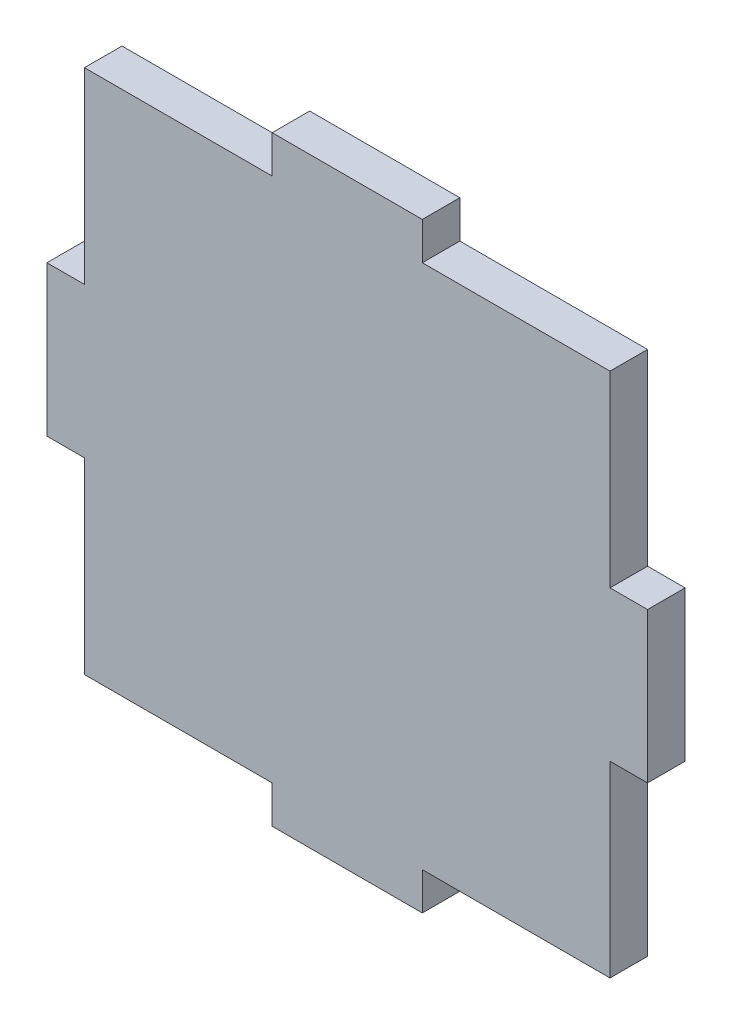
ISO-10303-21;
HEADER;
FILE_DESCRIPTION(('STEP AP214'),'2;1');
FILE_NAME('part.step','',(''),(''),'','','');
FILE_SCHEMA(('AUTOMOTIVE_DESIGN { 1 0 10303 214 1 1 1 1 }'));
ENDSEC;
DATA;
#1=APPLICATION_CONTEXT('core data for automotive mechanical design processes');
#2=APPLICATION_PROTOCOL_DEFINITION('international standard','automotive_design',2000,#1);
#3=PRODUCT_CONTEXT('',#1,'mechanical');
#4=PRODUCT('Part','Part','',(#3));
#5=PRODUCT_RELATED_PRODUCT_CATEGORY('part','',(#4));
#6=PRODUCT_DEFINITION_FORMATION('','',#4);
#7=PRODUCT_DEFINITION_CONTEXT('part definition',#1,'design');
#8=PRODUCT_DEFINITION('design','',#6,#7);
#9=PRODUCT_DEFINITION_SHAPE('','',#8);
#10=(LENGTH_UNIT() NAMED_UNIT(*) SI_UNIT(.MILLI.,.METRE.));
#11=(NAMED_UNIT(*) PLANE_ANGLE_UNIT() SI_UNIT($,.RADIAN.));
#12=(NAMED_UNIT(*) SI_UNIT($,.STERADIAN.) SOLID_ANGLE_UNIT());
#13=UNCERTAINTY_MEASURE_WITH_UNIT(LENGTH_MEASURE(1.E-05),#10,'distance_accuracy_value','');
#14=(GEOMETRIC_REPRESENTATION_CONTEXT(3) GLOBAL_UNCERTAINTY_ASSIGNED_CONTEXT((#13)) GLOBAL_UNIT_ASSIGNED_CONTEXT((#10,
#11,#12)) REPRESENTATION_CONTEXT('',''));
#15=CARTESIAN_POINT('',(0.,0.,0.));
#16=DIRECTION('',(0.,0.,1.));
#17=DIRECTION('',(1.,0.,0.));
#18=AXIS2_PLACEMENT_3D('',#15,#16,#17);
#19=CARTESIAN_POINT('',(138.962770275042,-1.5185006606796E-13,6.35));
#20=DIRECTION('',(1.,0.,0.));
#21=DIRECTION('',(0.,1.,0.));
#22=AXIS2_PLACEMENT_3D('',#19,#20,#21);
#23=PLANE('',#22);
#24=DIRECTION('',(0.,-1.,0.));
#25=VECTOR('',#24,1.);
#26=CARTESIAN_POINT('',(138.962770275042,-1.5185006606796E-13,0.));
#27=LINE('',#26,#25);
#28=CARTESIAN_POINT('',(138.962770275041,-334.378401611212,0.));
#29=VERTEX_POINT('',#28);
#30=CARTESIAN_POINT('',(138.962770275041,-359.778401611212,0.));
#31=VERTEX_POINT('',#30);
#32=EDGE_CURVE('E342',#29,#31,#27,.T.);
#33=ORIENTED_EDGE('',*,*,#32,.T.);
#34=DIRECTION('',(0.,0.,-1.));
#35=VECTOR('',#34,1.);
#36=CARTESIAN_POINT('',(138.962770275041,-359.778401611212,6.35));
#37=LINE('',#36,#35);
#38=CARTESIAN_POINT('',(138.962770275041,-359.778401611212,6.35));
#39=VERTEX_POINT('',#38);
#40=EDGE_CURVE('E12',#39,#31,#37,.T.);
#41=ORIENTED_EDGE('',*,*,#40,.F.);
#42=DIRECTION('',(0.,-1.,0.));
#43=VECTOR('',#42,1.);
#44=CARTESIAN_POINT('',(138.962770275042,-1.5185006606796E-13,6.35));
#45=LINE('',#44,#43);
#46=CARTESIAN_POINT('',(138.962770275041,-334.378401611212,6.35));
#47=VERTEX_POINT('',#46);
#48=EDGE_CURVE('E371',#47,#39,#45,.T.);
#49=ORIENTED_EDGE('',*,*,#48,.F.);
#50=DIRECTION('',(0.,0.,-1.));
#51=VECTOR('',#50,1.);
#52=CARTESIAN_POINT('',(138.962770275041,-334.378401611212,6.35));
#53=LINE('',#52,#51);
#54=EDGE_CURVE('E104',#47,#29,#53,.T.);
#55=ORIENTED_EDGE('',*,*,#54,.T.);
#56=EDGE_LOOP('',(#33,#41,#49,#55));
#57=FACE_BOUND('',#56,.T.);
#58=ADVANCED_FACE('F85',(#57),#23,.F.);
#59=CARTESIAN_POINT('',(0.,-359.778401611212,6.35));
#60=DIRECTION('',(0.,1.,0.));
#61=DIRECTION('',(0.,0.,1.));
#62=AXIS2_PLACEMENT_3D('',#59,#60,#61);
#63=PLANE('',#62);
#64=DIRECTION('',(1.,0.,0.));
#65=VECTOR('',#64,1.);
#66=CARTESIAN_POINT('',(0.,-359.778401611212,0.));
#67=LINE('',#66,#65);
#68=CARTESIAN_POINT('',(145.312770275041,-359.778401611212,0.));
#69=VERTEX_POINT('',#68);
#70=EDGE_CURVE('E372',#31,#69,#67,.T.);
#71=ORIENTED_EDGE('',*,*,#70,.T.);
#72=DIRECTION('',(0.,0.,-1.));
#73=VECTOR('',#72,1.);
#74=CARTESIAN_POINT('',(145.312770275041,-359.778401611212,6.35));
#75=LINE('',#74,#73);
#76=CARTESIAN_POINT('',(145.312770275041,-359.778401611212,6.35));
#77=VERTEX_POINT('',#76);
#78=EDGE_CURVE('E95',#77,#69,#75,.T.);
#79=ORIENTED_EDGE('',*,*,#78,.F.);
#80=DIRECTION('',(1.,0.,0.));
#81=VECTOR('',#80,1.);
#82=CARTESIAN_POINT('',(0.,-359.778401611212,6.35));
#83=LINE('',#82,#81);
#84=EDGE_CURVE('E378',#39,#77,#83,.T.);
#85=ORIENTED_EDGE('',*,*,#84,.F.);
#86=ORIENTED_EDGE('',*,*,#40,.T.);
#87=EDGE_LOOP('',(#71,#79,#85,#86));
#88=FACE_BOUND('',#87,.T.);
#89=ADVANCED_FACE('F387',(#88),#63,.F.);
#90=CARTESIAN_POINT('',(0.,-334.378401611212,6.35));
#91=DIRECTION('',(0.,1.,0.));
#92=DIRECTION('',(0.,0.,1.));
#93=AXIS2_PLACEMENT_3D('',#90,#91,#92);
#94=PLANE('',#93);
#95=DIRECTION('',(1.,0.,0.));
#96=VECTOR('',#95,1.);
#97=CARTESIAN_POINT('',(0.,-334.378401611212,0.));
#98=LINE('',#97,#96);
#99=CARTESIAN_POINT('',(145.312770275041,-334.378401611212,0.));
#100=VERTEX_POINT('',#99);
#101=EDGE_CURVE('E244',#29,#100,#98,.T.);
#102=ORIENTED_EDGE('',*,*,#101,.F.);
#103=ORIENTED_EDGE('',*,*,#54,.F.);
#104=DIRECTION('',(1.,0.,0.));
#105=VECTOR('',#104,1.);
#106=CARTESIAN_POINT('',(0.,-334.378401611212,6.35));
#107=LINE('',#106,#105);
#108=CARTESIAN_POINT('',(145.312770275041,-334.378401611212,6.35));
#109=VERTEX_POINT('',#108);
#110=EDGE_CURVE('E369',#47,#109,#107,.T.);
#111=ORIENTED_EDGE('',*,*,#110,.T.);
#112=DIRECTION('',(0.,0.,-1.));
#113=VECTOR('',#112,1.);
#114=CARTESIAN_POINT('',(145.312770275041,-334.378401611212,6.35));
#115=LINE('',#114,#113);
#116=EDGE_CURVE('E366',#109,#100,#115,.T.);
#117=ORIENTED_EDGE('',*,*,#116,.T.);
#118=EDGE_LOOP('',(#102,#103,#111,#117));
#119=FACE_BOUND('',#118,.T.);
#120=ADVANCED_FACE('F593',(#119),#94,.T.);
#121=CARTESIAN_POINT('',(0.,0.,6.35));
#122=DIRECTION('',(0.,0.,1.));
#123=DIRECTION('',(1.,0.,0.));
#124=AXIS2_PLACEMENT_3D('',#121,#122,#123);
#125=PLANE('',#124);
#126=ORIENTED_EDGE('',*,*,#48,.T.);
#127=ORIENTED_EDGE('',*,*,#84,.T.);
#128=DIRECTION('',(0.,-1.,0.));
#129=VECTOR('',#128,1.);
#130=CARTESIAN_POINT('',(145.312770275041,-302.628401611212,6.35));
#131=LINE('',#130,#129);
#132=CARTESIAN_POINT('',(145.312770275041,-391.528401611212,6.35));
#133=VERTEX_POINT('',#132);
#134=EDGE_CURVE('E273',#77,#133,#131,.T.);
#135=ORIENTED_EDGE('',*,*,#134,.T.);
#136=DIRECTION('',(1.,0.,0.));
#137=VECTOR('',#136,1.);
#138=CARTESIAN_POINT('',(145.312770275041,-391.528401611212,6.35));
#139=LINE('',#138,#137);
#140=CARTESIAN_POINT('',(177.062770275041,-391.528401611212,6.35));
#141=VERTEX_POINT('',#140);
#142=EDGE_CURVE('E276',#133,#141,#139,.T.);
#143=ORIENTED_EDGE('',*,*,#142,.T.);
#144=DIRECTION('',(0.,-1.,0.));
#145=VECTOR('',#144,1.);
#146=CARTESIAN_POINT('',(177.062770275041,0.,6.35));
#147=LINE('',#146,#145);
#148=CARTESIAN_POINT('',(177.062770275041,-397.878401611212,6.35));
#149=VERTEX_POINT('',#148);
#150=EDGE_CURVE('E353',#141,#149,#147,.T.);
#151=ORIENTED_EDGE('',*,*,#150,.T.);
#152=DIRECTION('',(-1.,0.,0.));
#153=VECTOR('',#152,1.);
#154=CARTESIAN_POINT('',(0.,-397.878401611212,6.35));
#155=LINE('',#154,#153);
#156=CARTESIAN_POINT('',(202.462770275041,-397.878401611212,6.35));
#157=VERTEX_POINT('',#156);
#158=EDGE_CURVE('E361',#157,#149,#155,.T.);
#159=ORIENTED_EDGE('',*,*,#158,.F.);
#160=DIRECTION('',(0.,-1.,0.));
#161=VECTOR('',#160,1.);
#162=CARTESIAN_POINT('',(202.462770275041,0.,6.35));
#163=LINE('',#162,#161);
#164=CARTESIAN_POINT('',(202.462770275041,-391.528401611212,6.35));
#165=VERTEX_POINT('',#164);
#166=EDGE_CURVE('E349',#165,#157,#163,.T.);
#167=ORIENTED_EDGE('',*,*,#166,.F.);
#168=CARTESIAN_POINT('',(234.212770275041,-391.528401611212,6.35));
#169=VERTEX_POINT('',#168);
#170=EDGE_CURVE('E280',#165,#169,#139,.T.);
#171=ORIENTED_EDGE('',*,*,#170,.T.);
#172=DIRECTION('',(0.,-1.,0.));
#173=VECTOR('',#172,1.);
#174=CARTESIAN_POINT('',(234.212770275041,-302.628401611212,6.35));
#175=LINE('',#174,#173);
#176=CARTESIAN_POINT('',(234.212770275041,-359.778401611212,6.35));
#177=VERTEX_POINT('',#176);
#178=EDGE_CURVE('E287',#177,#169,#175,.T.);
#179=ORIENTED_EDGE('',*,*,#178,.F.);
#180=DIRECTION('',(-1.,0.,0.));
#181=VECTOR('',#180,1.);
#182=CARTESIAN_POINT('',(0.,-359.778401611212,6.35));
#183=LINE('',#182,#181);
#184=CARTESIAN_POINT('',(240.562770275041,-359.778401611212,6.35));
#185=VERTEX_POINT('',#184);
#186=EDGE_CURVE('E323',#185,#177,#183,.T.);
#187=ORIENTED_EDGE('',*,*,#186,.F.);
#188=DIRECTION('',(0.,1.,0.));
#189=VECTOR('',#188,1.);
#190=CARTESIAN_POINT('',(240.562770275042,-5.25744737060952E-13,6.35));
#191=LINE('',#190,#189);
#192=CARTESIAN_POINT('',(240.562770275041,-334.378401611212,6.35));
#193=VERTEX_POINT('',#192);
#194=EDGE_CURVE('E327',#185,#193,#191,.T.);
#195=ORIENTED_EDGE('',*,*,#194,.T.);
#196=DIRECTION('',(-1.,0.,0.));
#197=VECTOR('',#196,1.);
#198=CARTESIAN_POINT('',(0.,-334.378401611212,6.35));
#199=LINE('',#198,#197);
#200=CARTESIAN_POINT('',(234.212770275041,-334.378401611212,6.35));
#201=VERTEX_POINT('',#200);
#202=EDGE_CURVE('E335',#193,#201,#199,.T.);
#203=ORIENTED_EDGE('',*,*,#202,.T.);
#204=CARTESIAN_POINT('',(234.212770275041,-302.628401611212,6.35));
#205=VERTEX_POINT('',#204);
#206=EDGE_CURVE('E283',#205,#201,#175,.T.);
#207=ORIENTED_EDGE('',*,*,#206,.F.);
#208=DIRECTION('',(1.,0.,0.));
#209=VECTOR('',#208,1.);
#210=CARTESIAN_POINT('',(145.312770275041,-302.628401611212,6.35));
#211=LINE('',#210,#209);
#212=CARTESIAN_POINT('',(202.462770275041,-302.628401611212,6.35));
#213=VERTEX_POINT('',#212);
#214=EDGE_CURVE('E245',#213,#205,#211,.T.);
#215=ORIENTED_EDGE('',*,*,#214,.F.);
#216=DIRECTION('',(0.,1.,0.));
#217=VECTOR('',#216,1.);
#218=CARTESIAN_POINT('',(202.462770275041,0.,6.35));
#219=LINE('',#218,#217);
#220=CARTESIAN_POINT('',(202.462770275041,-296.278401611212,6.35));
#221=VERTEX_POINT('',#220);
#222=EDGE_CURVE('E301',#213,#221,#219,.T.);
#223=ORIENTED_EDGE('',*,*,#222,.T.);
#224=DIRECTION('',(1.,0.,0.));
#225=VECTOR('',#224,1.);
#226=CARTESIAN_POINT('',(0.,-296.278401611212,6.35));
#227=LINE('',#226,#225);
#228=CARTESIAN_POINT('',(177.062770275041,-296.278401611212,6.35));
#229=VERTEX_POINT('',#228);
#230=EDGE_CURVE('E309',#229,#221,#227,.T.);
#231=ORIENTED_EDGE('',*,*,#230,.F.);
#232=DIRECTION('',(0.,1.,0.));
#233=VECTOR('',#232,1.);
#234=CARTESIAN_POINT('',(177.062770275041,0.,6.35));
#235=LINE('',#234,#233);
#236=CARTESIAN_POINT('',(177.062770275041,-302.628401611212,6.35));
#237=VERTEX_POINT('',#236);
#238=EDGE_CURVE('E298',#237,#229,#235,.T.);
#239=ORIENTED_EDGE('',*,*,#238,.F.);
#240=CARTESIAN_POINT('',(145.312770275041,-302.628401611212,6.35));
#241=VERTEX_POINT('',#240);
#242=EDGE_CURVE('E288',#241,#237,#211,.T.);
#243=ORIENTED_EDGE('',*,*,#242,.F.);
#244=EDGE_CURVE('E229',#241,#109,#131,.T.);
#245=ORIENTED_EDGE('',*,*,#244,.T.);
#246=ORIENTED_EDGE('',*,*,#110,.F.);
#247=EDGE_LOOP('',(#126,#127,#135,#143,#151,#159,#167,#171,#179,#187,#195,#203,#207,#215,#223,
#231,#239,#243,#245,#246));
#248=FACE_BOUND('',#247,.T.);
#249=ADVANCED_FACE('F382',(#248),#125,.T.);
#250=CARTESIAN_POINT('',(0.,0.,0.));
#251=DIRECTION('',(0.,0.,1.));
#252=DIRECTION('',(1.,0.,0.));
#253=AXIS2_PLACEMENT_3D('',#250,#251,#252);
#254=PLANE('',#253);
#255=ORIENTED_EDGE('',*,*,#32,.F.);
#256=ORIENTED_EDGE('',*,*,#101,.T.);
#257=DIRECTION('',(0.,-1.,0.));
#258=VECTOR('',#257,1.);
#259=CARTESIAN_POINT('',(145.312770275041,-302.628401611212,0.));
#260=LINE('',#259,#258);
#261=CARTESIAN_POINT('',(145.312770275041,-302.628401611212,0.));
#262=VERTEX_POINT('',#261);
#263=EDGE_CURVE('E226',#262,#100,#260,.T.);
#264=ORIENTED_EDGE('',*,*,#263,.F.);
#265=DIRECTION('',(1.,0.,0.));
#266=VECTOR('',#265,1.);
#267=CARTESIAN_POINT('',(145.312770275041,-302.628401611212,0.));
#268=LINE('',#267,#266);
#269=CARTESIAN_POINT('',(177.062770275041,-302.628401611212,0.));
#270=VERTEX_POINT('',#269);
#271=EDGE_CURVE('E242',#262,#270,#268,.T.);
#272=ORIENTED_EDGE('',*,*,#271,.T.);
#273=DIRECTION('',(0.,1.,0.));
#274=VECTOR('',#273,1.);
#275=CARTESIAN_POINT('',(177.062770275041,0.,0.));
#276=LINE('',#275,#274);
#277=CARTESIAN_POINT('',(177.062770275041,-296.278401611212,0.));
#278=VERTEX_POINT('',#277);
#279=EDGE_CURVE('E299',#270,#278,#276,.T.);
#280=ORIENTED_EDGE('',*,*,#279,.T.);
#281=DIRECTION('',(1.,0.,0.));
#282=VECTOR('',#281,1.);
#283=CARTESIAN_POINT('',(0.,-296.278401611212,0.));
#284=LINE('',#283,#282);
#285=CARTESIAN_POINT('',(202.462770275041,-296.278401611212,0.));
#286=VERTEX_POINT('',#285);
#287=EDGE_CURVE('E302',#278,#286,#284,.T.);
#288=ORIENTED_EDGE('',*,*,#287,.T.);
#289=DIRECTION('',(0.,1.,0.));
#290=VECTOR('',#289,1.);
#291=CARTESIAN_POINT('',(202.462770275041,0.,0.));
#292=LINE('',#291,#290);
#293=CARTESIAN_POINT('',(202.462770275041,-302.628401611212,0.));
#294=VERTEX_POINT('',#293);
#295=EDGE_CURVE('E234',#294,#286,#292,.T.);
#296=ORIENTED_EDGE('',*,*,#295,.F.);
#297=CARTESIAN_POINT('',(234.212770275041,-302.628401611212,0.));
#298=VERTEX_POINT('',#297);
#299=EDGE_CURVE('E249',#294,#298,#268,.T.);
#300=ORIENTED_EDGE('',*,*,#299,.T.);
#301=DIRECTION('',(0.,-1.,0.));
#302=VECTOR('',#301,1.);
#303=CARTESIAN_POINT('',(234.212770275041,-302.628401611212,0.));
#304=LINE('',#303,#302);
#305=CARTESIAN_POINT('',(234.212770275041,-334.378401611212,0.));
#306=VERTEX_POINT('',#305);
#307=EDGE_CURVE('E252',#298,#306,#304,.T.);
#308=ORIENTED_EDGE('',*,*,#307,.T.);
#309=DIRECTION('',(-1.,0.,0.));
#310=VECTOR('',#309,1.);
#311=CARTESIAN_POINT('',(0.,-334.378401611212,0.));
#312=LINE('',#311,#310);
#313=CARTESIAN_POINT('',(240.562770275041,-334.378401611212,0.));
#314=VERTEX_POINT('',#313);
#315=EDGE_CURVE('E328',#314,#306,#312,.T.);
#316=ORIENTED_EDGE('',*,*,#315,.F.);
#317=DIRECTION('',(0.,1.,0.));
#318=VECTOR('',#317,1.);
#319=CARTESIAN_POINT('',(240.562770275042,-5.25744737060952E-13,0.));
#320=LINE('',#319,#318);
#321=CARTESIAN_POINT('',(240.562770275041,-359.778401611212,0.));
#322=VERTEX_POINT('',#321);
#323=EDGE_CURVE('E292',#322,#314,#320,.T.);
#324=ORIENTED_EDGE('',*,*,#323,.F.);
#325=DIRECTION('',(-1.,0.,0.));
#326=VECTOR('',#325,1.);
#327=CARTESIAN_POINT('',(0.,-359.778401611212,0.));
#328=LINE('',#327,#326);
#329=CARTESIAN_POINT('',(234.212770275041,-359.778401611212,0.));
#330=VERTEX_POINT('',#329);
#331=EDGE_CURVE('E324',#322,#330,#328,.T.);
#332=ORIENTED_EDGE('',*,*,#331,.T.);
#333=CARTESIAN_POINT('',(234.212770275041,-391.528401611212,0.));
#334=VERTEX_POINT('',#333);
#335=EDGE_CURVE('E248',#330,#334,#304,.T.);
#336=ORIENTED_EDGE('',*,*,#335,.T.);
#337=DIRECTION('',(1.,0.,0.));
#338=VECTOR('',#337,1.);
#339=CARTESIAN_POINT('',(145.312770275041,-391.528401611212,0.));
#340=LINE('',#339,#338);
#341=CARTESIAN_POINT('',(202.462770275041,-391.528401611212,0.));
#342=VERTEX_POINT('',#341);
#343=EDGE_CURVE('E258',#342,#334,#340,.T.);
#344=ORIENTED_EDGE('',*,*,#343,.F.);
#345=DIRECTION('',(0.,-1.,0.));
#346=VECTOR('',#345,1.);
#347=CARTESIAN_POINT('',(202.462770275041,0.,0.));
#348=LINE('',#347,#346);
#349=CARTESIAN_POINT('',(202.462770275041,-397.878401611212,0.));
#350=VERTEX_POINT('',#349);
#351=EDGE_CURVE('E350',#342,#350,#348,.T.);
#352=ORIENTED_EDGE('',*,*,#351,.T.);
#353=DIRECTION('',(-1.,0.,0.));
#354=VECTOR('',#353,1.);
#355=CARTESIAN_POINT('',(0.,-397.878401611212,0.));
#356=LINE('',#355,#354);
#357=CARTESIAN_POINT('',(177.062770275041,-397.878401611212,0.));
#358=VERTEX_POINT('',#357);
#359=EDGE_CURVE('E354',#350,#358,#356,.T.);
#360=ORIENTED_EDGE('',*,*,#359,.T.);
#361=DIRECTION('',(0.,-1.,0.));
#362=VECTOR('',#361,1.);
#363=CARTESIAN_POINT('',(177.062770275041,0.,0.));
#364=LINE('',#363,#362);
#365=CARTESIAN_POINT('',(177.062770275041,-391.528401611212,0.));
#366=VERTEX_POINT('',#365);
#367=EDGE_CURVE('E316',#366,#358,#364,.T.);
#368=ORIENTED_EDGE('',*,*,#367,.F.);
#369=CARTESIAN_POINT('',(145.312770275041,-391.528401611212,0.));
#370=VERTEX_POINT('',#369);
#371=EDGE_CURVE('E259',#370,#366,#340,.T.);
#372=ORIENTED_EDGE('',*,*,#371,.F.);
#373=EDGE_CURVE('E217',#69,#370,#260,.T.);
#374=ORIENTED_EDGE('',*,*,#373,.F.);
#375=ORIENTED_EDGE('',*,*,#70,.F.);
#376=EDGE_LOOP('',(#255,#256,#264,#272,#280,#288,#296,#300,#308,#316,#324,#332,#336,#344,#352,
#360,#368,#372,#374,#375));
#377=FACE_BOUND('',#376,.T.);
#378=ADVANCED_FACE('F240',(#377),#254,.F.);
#379=CARTESIAN_POINT('',(0.,-296.278401611212,6.35));
#380=DIRECTION('',(0.,1.,0.));
#381=DIRECTION('',(0.,0.,1.));
#382=AXIS2_PLACEMENT_3D('',#379,#380,#381);
#383=PLANE('',#382);
#384=ORIENTED_EDGE('',*,*,#287,.F.);
#385=DIRECTION('',(0.,0.,-1.));
#386=VECTOR('',#385,1.);
#387=CARTESIAN_POINT('',(177.062770275041,-296.278401611212,6.35));
#388=LINE('',#387,#386);
#389=EDGE_CURVE('E295',#229,#278,#388,.T.);
#390=ORIENTED_EDGE('',*,*,#389,.F.);
#391=ORIENTED_EDGE('',*,*,#230,.T.);
#392=DIRECTION('',(0.,0.,-1.));
#393=VECTOR('',#392,1.);
#394=CARTESIAN_POINT('',(202.462770275041,-296.278401611212,6.35));
#395=LINE('',#394,#393);
#396=EDGE_CURVE('E293',#221,#286,#395,.T.);
#397=ORIENTED_EDGE('',*,*,#396,.T.);
#398=EDGE_LOOP('',(#384,#390,#391,#397));
#399=FACE_BOUND('',#398,.T.);
#400=ADVANCED_FACE('F433',(#399),#383,.T.);
#401=CARTESIAN_POINT('',(202.462770275041,0.,6.35));
#402=DIRECTION('',(-1.,0.,0.));
#403=DIRECTION('',(0.,0.,1.));
#404=AXIS2_PLACEMENT_3D('',#401,#402,#403);
#405=PLANE('',#404);
#406=ORIENTED_EDGE('',*,*,#295,.T.);
#407=ORIENTED_EDGE('',*,*,#396,.F.);
#408=ORIENTED_EDGE('',*,*,#222,.F.);
#409=DIRECTION('',(0.,0.,-1.));
#410=VECTOR('',#409,1.);
#411=CARTESIAN_POINT('',(202.462770275041,-302.628401611212,6.35));
#412=LINE('',#411,#410);
#413=EDGE_CURVE('E290',#213,#294,#412,.T.);
#414=ORIENTED_EDGE('',*,*,#413,.T.);
#415=EDGE_LOOP('',(#406,#407,#408,#414));
#416=FACE_BOUND('',#415,.T.);
#417=ADVANCED_FACE('F429',(#416),#405,.F.);
#418=CARTESIAN_POINT('',(0.,-334.378401611212,6.35));
#419=DIRECTION('',(0.,-1.,0.));
#420=DIRECTION('',(0.,0.,-1.));
#421=AXIS2_PLACEMENT_3D('',#418,#419,#420);
#422=PLANE('',#421);
#423=ORIENTED_EDGE('',*,*,#315,.T.);
#424=DIRECTION('',(0.,0.,-1.));
#425=VECTOR('',#424,1.);
#426=CARTESIAN_POINT('',(234.212770275041,-334.378401611212,6.35));
#427=LINE('',#426,#425);
#428=EDGE_CURVE('E317',#201,#306,#427,.T.);
#429=ORIENTED_EDGE('',*,*,#428,.F.);
#430=ORIENTED_EDGE('',*,*,#202,.F.);
#431=DIRECTION('',(0.,0.,-1.));
#432=VECTOR('',#431,1.);
#433=CARTESIAN_POINT('',(240.562770275041,-334.378401611212,6.35));
#434=LINE('',#433,#432);
#435=EDGE_CURVE('E313',#193,#314,#434,.T.);
#436=ORIENTED_EDGE('',*,*,#435,.T.);
#437=EDGE_LOOP('',(#423,#429,#430,#436));
#438=FACE_BOUND('',#437,.T.);
#439=ADVANCED_FACE('F421',(#438),#422,.F.);
#440=CARTESIAN_POINT('',(240.562770275042,-5.25744737060952E-13,6.35));
#441=DIRECTION('',(-1.,0.,0.));
#442=DIRECTION('',(0.,-1.,0.));
#443=AXIS2_PLACEMENT_3D('',#440,#441,#442);
#444=PLANE('',#443);
#445=ORIENTED_EDGE('',*,*,#323,.T.);
#446=ORIENTED_EDGE('',*,*,#435,.F.);
#447=ORIENTED_EDGE('',*,*,#194,.F.);
#448=DIRECTION('',(0.,0.,-1.));
#449=VECTOR('',#448,1.);
#450=CARTESIAN_POINT('',(240.562770275041,-359.778401611212,6.35));
#451=LINE('',#450,#449);
#452=EDGE_CURVE('E321',#185,#322,#451,.T.);
#453=ORIENTED_EDGE('',*,*,#452,.T.);
#454=EDGE_LOOP('',(#445,#446,#447,#453));
#455=FACE_BOUND('',#454,.T.);
#456=ADVANCED_FACE('F418',(#455),#444,.F.);
#457=CARTESIAN_POINT('',(0.,-359.778401611212,6.35));
#458=DIRECTION('',(0.,-1.,0.));
#459=DIRECTION('',(0.,0.,-1.));
#460=AXIS2_PLACEMENT_3D('',#457,#458,#459);
#461=PLANE('',#460);
#462=ORIENTED_EDGE('',*,*,#331,.F.);
#463=ORIENTED_EDGE('',*,*,#452,.F.);
#464=ORIENTED_EDGE('',*,*,#186,.T.);
#465=DIRECTION('',(0.,0.,-1.));
#466=VECTOR('',#465,1.);
#467=CARTESIAN_POINT('',(234.212770275041,-359.778401611212,6.35));
#468=LINE('',#467,#466);
#469=EDGE_CURVE('E319',#177,#330,#468,.T.);
#470=ORIENTED_EDGE('',*,*,#469,.T.);
#471=EDGE_LOOP('',(#462,#463,#464,#470));
#472=FACE_BOUND('',#471,.T.);
#473=ADVANCED_FACE('F413',(#472),#461,.T.);
#474=CARTESIAN_POINT('',(202.462770275041,0.,6.35));
#475=DIRECTION('',(1.,0.,0.));
#476=DIRECTION('',(0.,0.,-1.));
#477=AXIS2_PLACEMENT_3D('',#474,#475,#476);
#478=PLANE('',#477);
#479=ORIENTED_EDGE('',*,*,#351,.F.);
#480=DIRECTION('',(0.,0.,-1.));
#481=VECTOR('',#480,1.);
#482=CARTESIAN_POINT('',(202.462770275041,-391.528401611212,6.35));
#483=LINE('',#482,#481);
#484=EDGE_CURVE('E347',#165,#342,#483,.T.);
#485=ORIENTED_EDGE('',*,*,#484,.F.);
#486=ORIENTED_EDGE('',*,*,#166,.T.);
#487=DIRECTION('',(0.,0.,-1.));
#488=VECTOR('',#487,1.);
#489=CARTESIAN_POINT('',(202.462770275041,-397.878401611212,6.35));
#490=LINE('',#489,#488);
#491=EDGE_CURVE('E345',#157,#350,#490,.T.);
#492=ORIENTED_EDGE('',*,*,#491,.T.);
#493=EDGE_LOOP('',(#479,#485,#486,#492));
#494=FACE_BOUND('',#493,.T.);
#495=ADVANCED_FACE('F402',(#494),#478,.T.);
#496=CARTESIAN_POINT('',(0.,-397.878401611212,6.35));
#497=DIRECTION('',(0.,-1.,0.));
#498=DIRECTION('',(0.,0.,-1.));
#499=AXIS2_PLACEMENT_3D('',#496,#497,#498);
#500=PLANE('',#499);
#501=ORIENTED_EDGE('',*,*,#359,.F.);
#502=ORIENTED_EDGE('',*,*,#491,.F.);
#503=ORIENTED_EDGE('',*,*,#158,.T.);
#504=DIRECTION('',(0.,0.,-1.));
#505=VECTOR('',#504,1.);
#506=CARTESIAN_POINT('',(177.062770275041,-397.878401611212,6.35));
#507=LINE('',#506,#505);
#508=EDGE_CURVE('E343',#149,#358,#507,.T.);
#509=ORIENTED_EDGE('',*,*,#508,.T.);
#510=EDGE_LOOP('',(#501,#502,#503,#509));
#511=FACE_BOUND('',#510,.T.);
#512=ADVANCED_FACE('F444',(#511),#500,.T.);
#513=CARTESIAN_POINT('',(177.062770275041,0.,6.35));
#514=DIRECTION('',(-1.,0.,0.));
#515=DIRECTION('',(0.,0.,1.));
#516=AXIS2_PLACEMENT_3D('',#513,#514,#515);
#517=PLANE('',#516);
#518=ORIENTED_EDGE('',*,*,#279,.F.);
#519=DIRECTION('',(0.,0.,-1.));
#520=VECTOR('',#519,1.);
#521=CARTESIAN_POINT('',(177.062770275041,-302.628401611212,6.35));
#522=LINE('',#521,#520);
#523=EDGE_CURVE('E247',#237,#270,#522,.T.);
#524=ORIENTED_EDGE('',*,*,#523,.F.);
#525=ORIENTED_EDGE('',*,*,#238,.T.);
#526=ORIENTED_EDGE('',*,*,#389,.T.);
#527=EDGE_LOOP('',(#518,#524,#525,#526));
#528=FACE_BOUND('',#527,.T.);
#529=ADVANCED_FACE('F436',(#528),#517,.T.);
#530=CARTESIAN_POINT('',(177.062770275041,0.,6.35));
#531=DIRECTION('',(1.,0.,0.));
#532=DIRECTION('',(0.,0.,-1.));
#533=AXIS2_PLACEMENT_3D('',#530,#531,#532);
#534=PLANE('',#533);
#535=ORIENTED_EDGE('',*,*,#367,.T.);
#536=ORIENTED_EDGE('',*,*,#508,.F.);
#537=ORIENTED_EDGE('',*,*,#150,.F.);
#538=DIRECTION('',(0.,0.,-1.));
#539=VECTOR('',#538,1.);
#540=CARTESIAN_POINT('',(177.062770275041,-391.528401611212,6.35));
#541=LINE('',#540,#539);
#542=EDGE_CURVE('E340',#141,#366,#541,.T.);
#543=ORIENTED_EDGE('',*,*,#542,.T.);
#544=EDGE_LOOP('',(#535,#536,#537,#543));
#545=FACE_BOUND('',#544,.T.);
#546=ADVANCED_FACE('F395',(#545),#534,.F.);
#547=CARTESIAN_POINT('',(145.312770275041,-302.628401611212,6.35));
#548=DIRECTION('',(0.,1.,0.));
#549=DIRECTION('',(-1.,0.,0.));
#550=AXIS2_PLACEMENT_3D('',#547,#548,#549);
#551=PLANE('',#550);
#552=ORIENTED_EDGE('',*,*,#413,.F.);
#553=ORIENTED_EDGE('',*,*,#214,.T.);
#554=DIRECTION('',(0.,0.,-1.));
#555=VECTOR('',#554,1.);
#556=CARTESIAN_POINT('',(234.212770275041,-302.628401611212,6.35));
#557=LINE('',#556,#555);
#558=EDGE_CURVE('E89',#205,#298,#557,.T.);
#559=ORIENTED_EDGE('',*,*,#558,.T.);
#560=ORIENTED_EDGE('',*,*,#299,.F.);
#561=EDGE_LOOP('',(#552,#553,#559,#560));
#562=FACE_BOUND('',#561,.T.);
#563=ADVANCED_FACE('F437',(#562),#551,.T.);
#564=CARTESIAN_POINT('',(234.212770275041,-302.628401611212,6.35));
#565=DIRECTION('',(1.,0.,0.));
#566=DIRECTION('',(0.,0.,-1.));
#567=AXIS2_PLACEMENT_3D('',#564,#565,#566);
#568=PLANE('',#567);
#569=ORIENTED_EDGE('',*,*,#206,.T.);
#570=ORIENTED_EDGE('',*,*,#428,.T.);
#571=ORIENTED_EDGE('',*,*,#307,.F.);
#572=ORIENTED_EDGE('',*,*,#558,.F.);
#573=EDGE_LOOP('',(#569,#570,#571,#572));
#574=FACE_BOUND('',#573,.T.);
#575=ADVANCED_FACE('F423',(#574),#568,.T.);
#576=ORIENTED_EDGE('',*,*,#469,.F.);
#577=ORIENTED_EDGE('',*,*,#178,.T.);
#578=DIRECTION('',(0.,0.,-1.));
#579=VECTOR('',#578,1.);
#580=CARTESIAN_POINT('',(234.212770275041,-391.528401611212,6.35));
#581=LINE('',#580,#579);
#582=EDGE_CURVE('E262',#169,#334,#581,.T.);
#583=ORIENTED_EDGE('',*,*,#582,.T.);
#584=ORIENTED_EDGE('',*,*,#335,.F.);
#585=EDGE_LOOP('',(#576,#577,#583,#584));
#586=FACE_BOUND('',#585,.T.);
#587=ADVANCED_FACE('F410',(#586),#568,.T.);
#588=CARTESIAN_POINT('',(145.312770275041,-391.528401611212,6.35));
#589=DIRECTION('',(0.,1.,0.));
#590=DIRECTION('',(-1.,0.,0.));
#591=AXIS2_PLACEMENT_3D('',#588,#589,#590);
#592=PLANE('',#591);
#593=ORIENTED_EDGE('',*,*,#170,.F.);
#594=ORIENTED_EDGE('',*,*,#484,.T.);
#595=ORIENTED_EDGE('',*,*,#343,.T.);
#596=ORIENTED_EDGE('',*,*,#582,.F.);
#597=EDGE_LOOP('',(#593,#594,#595,#596));
#598=FACE_BOUND('',#597,.T.);
#599=ADVANCED_FACE('F407',(#598),#592,.F.);
#600=ORIENTED_EDGE('',*,*,#242,.T.);
#601=ORIENTED_EDGE('',*,*,#523,.T.);
#602=ORIENTED_EDGE('',*,*,#271,.F.);
#603=DIRECTION('',(0.,0.,-1.));
#604=VECTOR('',#603,1.);
#605=CARTESIAN_POINT('',(145.312770275041,-302.628401611212,6.35));
#606=LINE('',#605,#604);
#607=EDGE_CURVE('E223',#241,#262,#606,.T.);
#608=ORIENTED_EDGE('',*,*,#607,.F.);
#609=EDGE_LOOP('',(#600,#601,#602,#608));
#610=FACE_BOUND('',#609,.T.);
#611=ADVANCED_FACE('F87',(#610),#551,.T.);
#612=ORIENTED_EDGE('',*,*,#542,.F.);
#613=ORIENTED_EDGE('',*,*,#142,.F.);
#614=DIRECTION('',(0.,0.,-1.));
#615=VECTOR('',#614,1.);
#616=CARTESIAN_POINT('',(145.312770275041,-391.528401611212,6.35));
#617=LINE('',#616,#615);
#618=EDGE_CURVE('E235',#133,#370,#617,.T.);
#619=ORIENTED_EDGE('',*,*,#618,.T.);
#620=ORIENTED_EDGE('',*,*,#371,.T.);
#621=EDGE_LOOP('',(#612,#613,#619,#620));
#622=FACE_BOUND('',#621,.T.);
#623=ADVANCED_FACE('F392',(#622),#592,.F.);
#624=CARTESIAN_POINT('',(145.312770275041,-302.628401611212,6.35));
#625=DIRECTION('',(1.,0.,0.));
#626=DIRECTION('',(0.,1.,0.));
#627=AXIS2_PLACEMENT_3D('',#624,#625,#626);
#628=PLANE('',#627);
#629=ORIENTED_EDGE('',*,*,#134,.F.);
#630=ORIENTED_EDGE('',*,*,#78,.T.);
#631=ORIENTED_EDGE('',*,*,#373,.T.);
#632=ORIENTED_EDGE('',*,*,#618,.F.);
#633=EDGE_LOOP('',(#629,#630,#631,#632));
#634=FACE_BOUND('',#633,.T.);
#635=ADVANCED_FACE('F389',(#634),#628,.F.);
#636=ORIENTED_EDGE('',*,*,#116,.F.);
#637=ORIENTED_EDGE('',*,*,#244,.F.);
#638=ORIENTED_EDGE('',*,*,#607,.T.);
#639=ORIENTED_EDGE('',*,*,#263,.T.);
#640=EDGE_LOOP('',(#636,#637,#638,#639));
#641=FACE_BOUND('',#640,.T.);
#642=ADVANCED_FACE('F225',(#641),#628,.F.);
#643=CLOSED_SHELL('',(#58,#89,#120,#249,#378,#400,#417,#439,#456,#473,#495,#512,#529,#546,#563,
#575,#587,#599,#611,#623,#635,#642));
#644=MANIFOLD_SOLID_BREP('B2',#643);
#645=ADVANCED_BREP_SHAPE_REPRESENTATION('',(#18,#644),#14);
#646=SHAPE_DEFINITION_REPRESENTATION(#9,#645);
ENDSEC;
END-ISO-10303-21;
